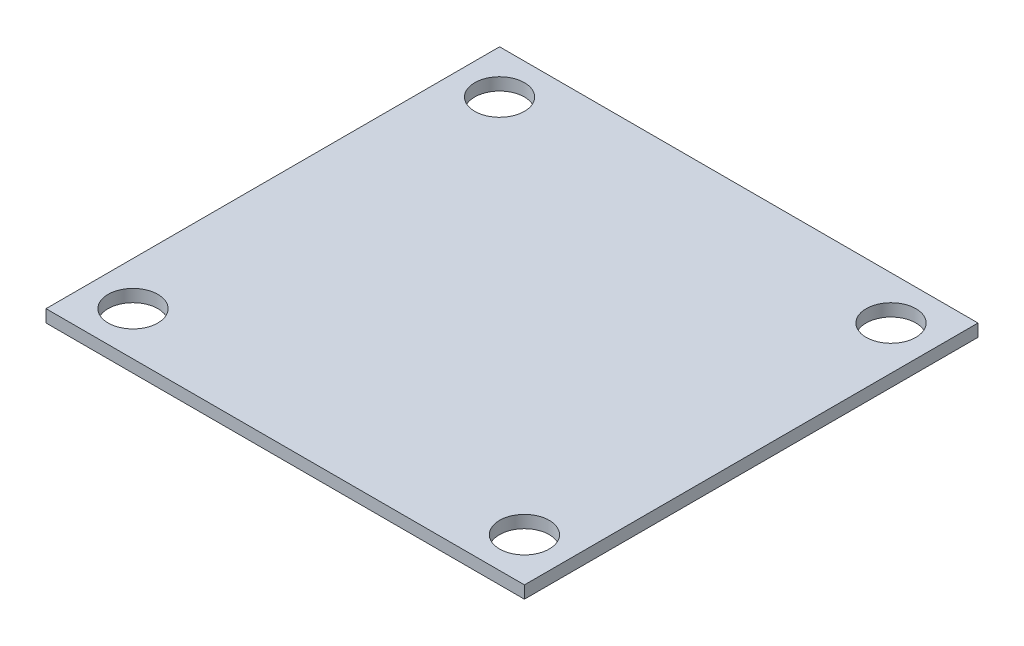
ISO-10303-21;
HEADER;
FILE_DESCRIPTION(('STEP AP214'),'2;1');
FILE_NAME('part.step','',(''),(''),'','','');
FILE_SCHEMA(('AUTOMOTIVE_DESIGN { 1 0 10303 214 1 1 1 1 }'));
ENDSEC;
DATA;
#1=APPLICATION_CONTEXT('core data for automotive mechanical design processes');
#2=APPLICATION_PROTOCOL_DEFINITION('international standard','automotive_design',2000,#1);
#3=PRODUCT_CONTEXT('',#1,'mechanical');
#4=PRODUCT('Part','Part','',(#3));
#5=PRODUCT_RELATED_PRODUCT_CATEGORY('part','',(#4));
#6=PRODUCT_DEFINITION_FORMATION('','',#4);
#7=PRODUCT_DEFINITION_CONTEXT('part definition',#1,'design');
#8=PRODUCT_DEFINITION('design','',#6,#7);
#9=PRODUCT_DEFINITION_SHAPE('','',#8);
#10=(LENGTH_UNIT() NAMED_UNIT(*) SI_UNIT(.MILLI.,.METRE.));
#11=(NAMED_UNIT(*) PLANE_ANGLE_UNIT() SI_UNIT($,.RADIAN.));
#12=(NAMED_UNIT(*) SI_UNIT($,.STERADIAN.) SOLID_ANGLE_UNIT());
#13=UNCERTAINTY_MEASURE_WITH_UNIT(LENGTH_MEASURE(1.E-05),#10,'distance_accuracy_value','');
#14=(GEOMETRIC_REPRESENTATION_CONTEXT(3) GLOBAL_UNCERTAINTY_ASSIGNED_CONTEXT((#13)) GLOBAL_UNIT_ASSIGNED_CONTEXT((#10,
#11,#12)) REPRESENTATION_CONTEXT('',''));
#15=CARTESIAN_POINT('',(0.,0.,0.));
#16=DIRECTION('',(0.,0.,1.));
#17=DIRECTION('',(1.,0.,0.));
#18=AXIS2_PLACEMENT_3D('',#15,#16,#17);
#19=CARTESIAN_POINT('',(0.,1.,0.));
#20=DIRECTION('',(0.,-1.,0.));
#21=DIRECTION('',(0.,0.,-1.));
#22=AXIS2_PLACEMENT_3D('',#19,#20,#21);
#23=PLANE('',#22);
#24=DIRECTION('',(0.,0.,-1.));
#25=VECTOR('',#24,1.);
#26=CARTESIAN_POINT('',(19.25,1.,18.25));
#27=LINE('',#26,#25);
#28=CARTESIAN_POINT('',(19.25,1.,18.25));
#29=VERTEX_POINT('',#28);
#30=CARTESIAN_POINT('',(19.25,1.,-18.25));
#31=VERTEX_POINT('',#30);
#32=EDGE_CURVE('E88',#29,#31,#27,.T.);
#33=ORIENTED_EDGE('',*,*,#32,.T.);
#34=DIRECTION('',(-1.,0.,0.));
#35=VECTOR('',#34,1.);
#36=CARTESIAN_POINT('',(-19.25,1.,-18.25));
#37=LINE('',#36,#35);
#38=CARTESIAN_POINT('',(-19.25,1.,-18.25));
#39=VERTEX_POINT('',#38);
#40=EDGE_CURVE('E83',#31,#39,#37,.T.);
#41=ORIENTED_EDGE('',*,*,#40,.T.);
#42=DIRECTION('',(0.,0.,1.));
#43=VECTOR('',#42,1.);
#44=CARTESIAN_POINT('',(-19.25,1.,18.25));
#45=LINE('',#44,#43);
#46=CARTESIAN_POINT('',(-19.25,1.,18.25));
#47=VERTEX_POINT('',#46);
#48=EDGE_CURVE('E86',#39,#47,#45,.T.);
#49=ORIENTED_EDGE('',*,*,#48,.T.);
#50=DIRECTION('',(1.,0.,0.));
#51=VECTOR('',#50,1.);
#52=CARTESIAN_POINT('',(-19.25,1.,18.25));
#53=LINE('',#52,#51);
#54=EDGE_CURVE('E53',#47,#29,#53,.T.);
#55=ORIENTED_EDGE('',*,*,#54,.T.);
#56=EDGE_LOOP('',(#33,#41,#49,#55));
#57=FACE_BOUND('',#56,.T.);
#58=CARTESIAN_POINT('',(15.75,1.,-14.75));
#59=DIRECTION('',(0.,1.,0.));
#60=DIRECTION('',(0.,0.,1.));
#61=AXIS2_PLACEMENT_3D('',#58,#59,#60);
#62=CIRCLE('',#61,2.);
#63=CARTESIAN_POINT('',(15.75,1.,-12.75));
#64=VERTEX_POINT('',#63);
#65=EDGE_CURVE('E103',#64,#64,#62,.T.);
#66=ORIENTED_EDGE('',*,*,#65,.F.);
#67=EDGE_LOOP('',(#66));
#68=FACE_BOUND('',#67,.T.);
#69=CARTESIAN_POINT('',(-15.75,1.,14.75));
#70=DIRECTION('',(0.,1.,0.));
#71=DIRECTION('',(0.,0.,1.));
#72=AXIS2_PLACEMENT_3D('',#69,#70,#71);
#73=CIRCLE('',#72,2.);
#74=CARTESIAN_POINT('',(-15.75,1.,16.75));
#75=VERTEX_POINT('',#74);
#76=EDGE_CURVE('E118',#75,#75,#73,.T.);
#77=ORIENTED_EDGE('',*,*,#76,.F.);
#78=EDGE_LOOP('',(#77));
#79=FACE_BOUND('',#78,.T.);
#80=CARTESIAN_POINT('',(15.75,1.,14.75));
#81=DIRECTION('',(0.,1.,0.));
#82=DIRECTION('',(0.,0.,1.));
#83=AXIS2_PLACEMENT_3D('',#80,#81,#82);
#84=CIRCLE('',#83,2.);
#85=CARTESIAN_POINT('',(15.75,1.,16.75));
#86=VERTEX_POINT('',#85);
#87=EDGE_CURVE('E124',#86,#86,#84,.T.);
#88=ORIENTED_EDGE('',*,*,#87,.F.);
#89=EDGE_LOOP('',(#88));
#90=FACE_BOUND('',#89,.T.);
#91=CARTESIAN_POINT('',(-15.75,1.,-14.75));
#92=DIRECTION('',(0.,1.,0.));
#93=DIRECTION('',(0.,0.,1.));
#94=AXIS2_PLACEMENT_3D('',#91,#92,#93);
#95=CIRCLE('',#94,2.);
#96=CARTESIAN_POINT('',(-15.75,1.,-12.75));
#97=VERTEX_POINT('',#96);
#98=EDGE_CURVE('E130',#97,#97,#95,.T.);
#99=ORIENTED_EDGE('',*,*,#98,.F.);
#100=EDGE_LOOP('',(#99));
#101=FACE_BOUND('',#100,.T.);
#102=ADVANCED_FACE('F36',(#57,#68,#79,#90,#101),#23,.F.);
#103=CARTESIAN_POINT('',(0.,0.,0.));
#104=DIRECTION('',(0.,-1.,0.));
#105=DIRECTION('',(0.,0.,-1.));
#106=AXIS2_PLACEMENT_3D('',#103,#104,#105);
#107=PLANE('',#106);
#108=CARTESIAN_POINT('',(15.75,0.,14.75));
#109=DIRECTION('',(0.,1.,0.));
#110=DIRECTION('',(0.,0.,1.));
#111=AXIS2_PLACEMENT_3D('',#108,#109,#110);
#112=CIRCLE('',#111,2.);
#113=CARTESIAN_POINT('',(15.75,0.,16.75));
#114=VERTEX_POINT('',#113);
#115=EDGE_CURVE('E127',#114,#114,#112,.T.);
#116=ORIENTED_EDGE('',*,*,#115,.T.);
#117=EDGE_LOOP('',(#116));
#118=FACE_BOUND('',#117,.T.);
#119=CARTESIAN_POINT('',(15.75,0.,-14.75));
#120=DIRECTION('',(0.,1.,0.));
#121=DIRECTION('',(0.,0.,1.));
#122=AXIS2_PLACEMENT_3D('',#119,#120,#121);
#123=CIRCLE('',#122,2.);
#124=CARTESIAN_POINT('',(15.75,0.,-12.75));
#125=VERTEX_POINT('',#124);
#126=EDGE_CURVE('E115',#125,#125,#123,.T.);
#127=ORIENTED_EDGE('',*,*,#126,.T.);
#128=EDGE_LOOP('',(#127));
#129=FACE_BOUND('',#128,.T.);
#130=DIRECTION('',(0.,0.,-1.));
#131=VECTOR('',#130,1.);
#132=CARTESIAN_POINT('',(19.25,0.,18.25));
#133=LINE('',#132,#131);
#134=CARTESIAN_POINT('',(19.25,0.,18.25));
#135=VERTEX_POINT('',#134);
#136=CARTESIAN_POINT('',(19.25,0.,-18.25));
#137=VERTEX_POINT('',#136);
#138=EDGE_CURVE('E100',#135,#137,#133,.T.);
#139=ORIENTED_EDGE('',*,*,#138,.F.);
#140=DIRECTION('',(1.,0.,0.));
#141=VECTOR('',#140,1.);
#142=CARTESIAN_POINT('',(-19.25,0.,18.25));
#143=LINE('',#142,#141);
#144=CARTESIAN_POINT('',(-19.25,0.,18.25));
#145=VERTEX_POINT('',#144);
#146=EDGE_CURVE('E76',#145,#135,#143,.T.);
#147=ORIENTED_EDGE('',*,*,#146,.F.);
#148=DIRECTION('',(0.,0.,1.));
#149=VECTOR('',#148,1.);
#150=CARTESIAN_POINT('',(-19.25,0.,18.25));
#151=LINE('',#150,#149);
#152=CARTESIAN_POINT('',(-19.25,0.,-18.25));
#153=VERTEX_POINT('',#152);
#154=EDGE_CURVE('E70',#153,#145,#151,.T.);
#155=ORIENTED_EDGE('',*,*,#154,.F.);
#156=DIRECTION('',(-1.,0.,0.));
#157=VECTOR('',#156,1.);
#158=CARTESIAN_POINT('',(-19.25,0.,-18.25));
#159=LINE('',#158,#157);
#160=EDGE_CURVE('E92',#137,#153,#159,.T.);
#161=ORIENTED_EDGE('',*,*,#160,.F.);
#162=EDGE_LOOP('',(#139,#147,#155,#161));
#163=FACE_BOUND('',#162,.T.);
#164=CARTESIAN_POINT('',(-15.75,0.,14.75));
#165=DIRECTION('',(0.,1.,0.));
#166=DIRECTION('',(0.,0.,1.));
#167=AXIS2_PLACEMENT_3D('',#164,#165,#166);
#168=CIRCLE('',#167,2.);
#169=CARTESIAN_POINT('',(-15.75,0.,16.75));
#170=VERTEX_POINT('',#169);
#171=EDGE_CURVE('E121',#170,#170,#168,.T.);
#172=ORIENTED_EDGE('',*,*,#171,.T.);
#173=EDGE_LOOP('',(#172));
#174=FACE_BOUND('',#173,.T.);
#175=CARTESIAN_POINT('',(-15.75,0.,-14.75));
#176=DIRECTION('',(0.,1.,0.));
#177=DIRECTION('',(0.,0.,1.));
#178=AXIS2_PLACEMENT_3D('',#175,#176,#177);
#179=CIRCLE('',#178,2.);
#180=CARTESIAN_POINT('',(-15.75,0.,-12.75));
#181=VERTEX_POINT('',#180);
#182=EDGE_CURVE('E133',#181,#181,#179,.T.);
#183=ORIENTED_EDGE('',*,*,#182,.T.);
#184=EDGE_LOOP('',(#183));
#185=FACE_BOUND('',#184,.T.);
#186=ADVANCED_FACE('F111',(#118,#129,#163,#174,#185),#107,.T.);
#187=CARTESIAN_POINT('',(19.25,1.,18.25));
#188=DIRECTION('',(-1.,0.,0.));
#189=DIRECTION('',(0.,0.,1.));
#190=AXIS2_PLACEMENT_3D('',#187,#188,#189);
#191=PLANE('',#190);
#192=ORIENTED_EDGE('',*,*,#138,.T.);
#193=DIRECTION('',(0.,-1.,0.));
#194=VECTOR('',#193,1.);
#195=CARTESIAN_POINT('',(19.25,1.,-18.25));
#196=LINE('',#195,#194);
#197=EDGE_CURVE('E11',#31,#137,#196,.T.);
#198=ORIENTED_EDGE('',*,*,#197,.F.);
#199=ORIENTED_EDGE('',*,*,#32,.F.);
#200=DIRECTION('',(0.,-1.,0.));
#201=VECTOR('',#200,1.);
#202=CARTESIAN_POINT('',(19.25,1.,18.25));
#203=LINE('',#202,#201);
#204=EDGE_CURVE('E96',#29,#135,#203,.T.);
#205=ORIENTED_EDGE('',*,*,#204,.T.);
#206=EDGE_LOOP('',(#192,#198,#199,#205));
#207=FACE_BOUND('',#206,.T.);
#208=ADVANCED_FACE('F38',(#207),#191,.F.);
#209=CARTESIAN_POINT('',(-19.25,1.,-18.25));
#210=DIRECTION('',(0.,0.,1.));
#211=DIRECTION('',(1.,0.,0.));
#212=AXIS2_PLACEMENT_3D('',#209,#210,#211);
#213=PLANE('',#212);
#214=ORIENTED_EDGE('',*,*,#160,.T.);
#215=DIRECTION('',(0.,-1.,0.));
#216=VECTOR('',#215,1.);
#217=CARTESIAN_POINT('',(-19.25,1.,-18.25));
#218=LINE('',#217,#216);
#219=EDGE_CURVE('E45',#39,#153,#218,.T.);
#220=ORIENTED_EDGE('',*,*,#219,.F.);
#221=ORIENTED_EDGE('',*,*,#40,.F.);
#222=ORIENTED_EDGE('',*,*,#197,.T.);
#223=EDGE_LOOP('',(#214,#220,#221,#222));
#224=FACE_BOUND('',#223,.T.);
#225=ADVANCED_FACE('F91',(#224),#213,.F.);
#226=CARTESIAN_POINT('',(-19.25,1.,18.25));
#227=DIRECTION('',(1.,0.,0.));
#228=DIRECTION('',(0.,0.,-1.));
#229=AXIS2_PLACEMENT_3D('',#226,#227,#228);
#230=PLANE('',#229);
#231=ORIENTED_EDGE('',*,*,#154,.T.);
#232=DIRECTION('',(0.,-1.,0.));
#233=VECTOR('',#232,1.);
#234=CARTESIAN_POINT('',(-19.25,1.,18.25));
#235=LINE('',#234,#233);
#236=EDGE_CURVE('E93',#47,#145,#235,.T.);
#237=ORIENTED_EDGE('',*,*,#236,.F.);
#238=ORIENTED_EDGE('',*,*,#48,.F.);
#239=ORIENTED_EDGE('',*,*,#219,.T.);
#240=EDGE_LOOP('',(#231,#237,#238,#239));
#241=FACE_BOUND('',#240,.T.);
#242=ADVANCED_FACE('F94',(#241),#230,.F.);
#243=CARTESIAN_POINT('',(-19.25,1.,18.25));
#244=DIRECTION('',(0.,0.,-1.));
#245=DIRECTION('',(-1.,0.,0.));
#246=AXIS2_PLACEMENT_3D('',#243,#244,#245);
#247=PLANE('',#246);
#248=ORIENTED_EDGE('',*,*,#146,.T.);
#249=ORIENTED_EDGE('',*,*,#204,.F.);
#250=ORIENTED_EDGE('',*,*,#54,.F.);
#251=ORIENTED_EDGE('',*,*,#236,.T.);
#252=EDGE_LOOP('',(#248,#249,#250,#251));
#253=FACE_BOUND('',#252,.T.);
#254=ADVANCED_FACE('F108',(#253),#247,.F.);
#255=CARTESIAN_POINT('',(15.75,1.,-14.75));
#256=DIRECTION('',(0.,-1.,0.));
#257=DIRECTION('',(0.,0.,-1.));
#258=AXIS2_PLACEMENT_3D('',#255,#256,#257);
#259=CYLINDRICAL_SURFACE('',#258,2.);
#260=ORIENTED_EDGE('',*,*,#65,.T.);
#261=EDGE_LOOP('',(#260));
#262=FACE_BOUND('',#261,.T.);
#263=ORIENTED_EDGE('',*,*,#126,.F.);
#264=EDGE_LOOP('',(#263));
#265=FACE_BOUND('',#264,.T.);
#266=ADVANCED_FACE('F150',(#262,#265),#259,.F.);
#267=CARTESIAN_POINT('',(-15.75,1.,14.75));
#268=DIRECTION('',(0.,-1.,0.));
#269=DIRECTION('',(0.,0.,-1.));
#270=AXIS2_PLACEMENT_3D('',#267,#268,#269);
#271=CYLINDRICAL_SURFACE('',#270,2.);
#272=ORIENTED_EDGE('',*,*,#76,.T.);
#273=EDGE_LOOP('',(#272));
#274=FACE_BOUND('',#273,.T.);
#275=ORIENTED_EDGE('',*,*,#171,.F.);
#276=EDGE_LOOP('',(#275));
#277=FACE_BOUND('',#276,.T.);
#278=ADVANCED_FACE('F196',(#274,#277),#271,.F.);
#279=CARTESIAN_POINT('',(15.75,1.,14.75));
#280=DIRECTION('',(0.,-1.,0.));
#281=DIRECTION('',(0.,0.,-1.));
#282=AXIS2_PLACEMENT_3D('',#279,#280,#281);
#283=CYLINDRICAL_SURFACE('',#282,2.);
#284=ORIENTED_EDGE('',*,*,#87,.T.);
#285=EDGE_LOOP('',(#284));
#286=FACE_BOUND('',#285,.T.);
#287=ORIENTED_EDGE('',*,*,#115,.F.);
#288=EDGE_LOOP('',(#287));
#289=FACE_BOUND('',#288,.T.);
#290=ADVANCED_FACE('F204',(#286,#289),#283,.F.);
#291=CARTESIAN_POINT('',(-15.75,1.,-14.75));
#292=DIRECTION('',(0.,-1.,0.));
#293=DIRECTION('',(0.,0.,-1.));
#294=AXIS2_PLACEMENT_3D('',#291,#292,#293);
#295=CYLINDRICAL_SURFACE('',#294,2.);
#296=ORIENTED_EDGE('',*,*,#98,.T.);
#297=EDGE_LOOP('',(#296));
#298=FACE_BOUND('',#297,.T.);
#299=ORIENTED_EDGE('',*,*,#182,.F.);
#300=EDGE_LOOP('',(#299));
#301=FACE_BOUND('',#300,.T.);
#302=ADVANCED_FACE('F139',(#298,#301),#295,.F.);
#303=CLOSED_SHELL('',(#102,#186,#208,#225,#242,#254,#266,#278,#290,#302));
#304=MANIFOLD_SOLID_BREP('B2',#303);
#305=ADVANCED_BREP_SHAPE_REPRESENTATION('',(#18,#304),#14);
#306=SHAPE_DEFINITION_REPRESENTATION(#9,#305);
ENDSEC;
END-ISO-10303-21;
